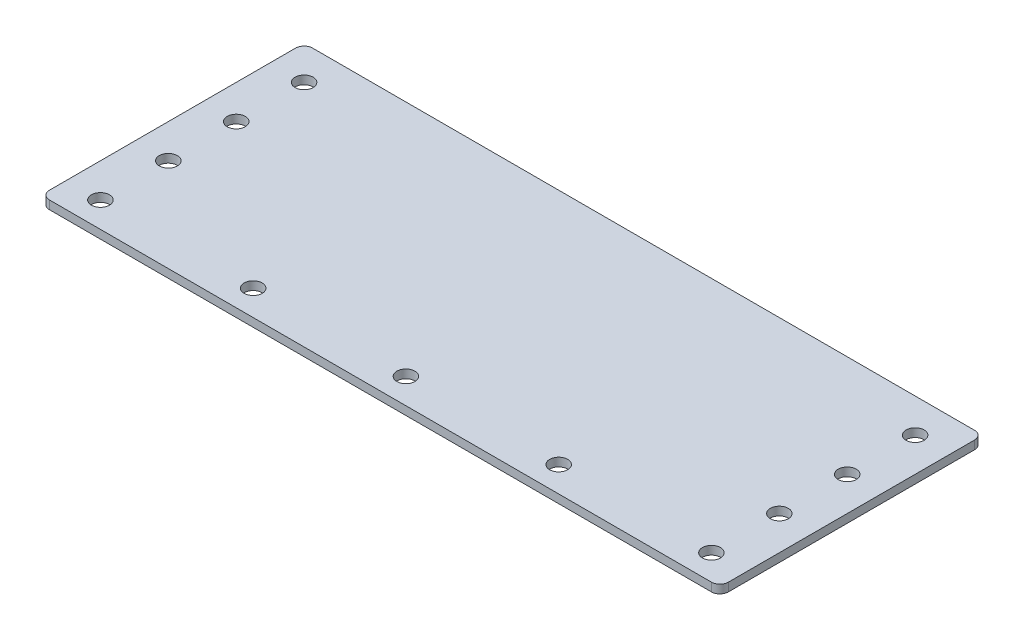
ISO-10303-21;
HEADER;
FILE_DESCRIPTION(('STEP AP214'),'2;1');
FILE_NAME('part.step','',(''),(''),'','','');
FILE_SCHEMA(('AUTOMOTIVE_DESIGN { 1 0 10303 214 1 1 1 1 }'));
ENDSEC;
DATA;
#1=APPLICATION_CONTEXT('core data for automotive mechanical design processes');
#2=APPLICATION_PROTOCOL_DEFINITION('international standard','automotive_design',2000,#1);
#3=PRODUCT_CONTEXT('',#1,'mechanical');
#4=PRODUCT('Part','Part','',(#3));
#5=PRODUCT_RELATED_PRODUCT_CATEGORY('part','',(#4));
#6=PRODUCT_DEFINITION_FORMATION('','',#4);
#7=PRODUCT_DEFINITION_CONTEXT('part definition',#1,'design');
#8=PRODUCT_DEFINITION('design','',#6,#7);
#9=PRODUCT_DEFINITION_SHAPE('','',#8);
#10=(LENGTH_UNIT() NAMED_UNIT(*) SI_UNIT(.MILLI.,.METRE.));
#11=(NAMED_UNIT(*) PLANE_ANGLE_UNIT() SI_UNIT($,.RADIAN.));
#12=(NAMED_UNIT(*) SI_UNIT($,.STERADIAN.) SOLID_ANGLE_UNIT());
#13=UNCERTAINTY_MEASURE_WITH_UNIT(LENGTH_MEASURE(1.E-05),#10,'distance_accuracy_value','');
#14=(GEOMETRIC_REPRESENTATION_CONTEXT(3) GLOBAL_UNCERTAINTY_ASSIGNED_CONTEXT((#13)) GLOBAL_UNIT_ASSIGNED_CONTEXT((#10,
#11,#12)) REPRESENTATION_CONTEXT('',''));
#15=CARTESIAN_POINT('',(0.,0.,0.));
#16=DIRECTION('',(0.,0.,1.));
#17=DIRECTION('',(1.,0.,0.));
#18=AXIS2_PLACEMENT_3D('',#15,#16,#17);
#19=CARTESIAN_POINT('',(0.,3.175,49.2125));
#20=DIRECTION('',(0.,0.,-1.));
#21=DIRECTION('',(-1.,0.,0.));
#22=AXIS2_PLACEMENT_3D('',#19,#20,#21);
#23=PLANE('',#22);
#24=DIRECTION('',(1.,0.,0.));
#25=VECTOR('',#24,1.);
#26=CARTESIAN_POINT('',(0.,3.175,49.2125));
#27=LINE('',#26,#25);
#28=CARTESIAN_POINT('',(-123.825,3.175,49.2125));
#29=VERTEX_POINT('',#28);
#30=CARTESIAN_POINT('',(123.825,3.175,49.2125));
#31=VERTEX_POINT('',#30);
#32=EDGE_CURVE('E156',#29,#31,#27,.T.);
#33=ORIENTED_EDGE('',*,*,#32,.F.);
#34=DIRECTION('',(0.,-1.,0.));
#35=VECTOR('',#34,1.);
#36=CARTESIAN_POINT('',(-123.825,0.,49.2125));
#37=LINE('',#36,#35);
#38=CARTESIAN_POINT('',(-123.825,0.,49.2125));
#39=VERTEX_POINT('',#38);
#40=EDGE_CURVE('E11',#29,#39,#37,.T.);
#41=ORIENTED_EDGE('',*,*,#40,.T.);
#42=DIRECTION('',(1.,0.,0.));
#43=VECTOR('',#42,1.);
#44=CARTESIAN_POINT('',(0.,0.,49.2125));
#45=LINE('',#44,#43);
#46=CARTESIAN_POINT('',(123.825,0.,49.2125));
#47=VERTEX_POINT('',#46);
#48=EDGE_CURVE('E159',#39,#47,#45,.T.);
#49=ORIENTED_EDGE('',*,*,#48,.T.);
#50=DIRECTION('',(0.,-1.,0.));
#51=VECTOR('',#50,1.);
#52=CARTESIAN_POINT('',(123.825,3.175,49.2125));
#53=LINE('',#52,#51);
#54=EDGE_CURVE('E45',#47,#31,#53,.F.);
#55=ORIENTED_EDGE('',*,*,#54,.T.);
#56=EDGE_LOOP('',(#33,#41,#49,#55));
#57=FACE_BOUND('',#56,.T.);
#58=ADVANCED_FACE('F37',(#57),#23,.F.);
#59=CARTESIAN_POINT('',(127.,3.175,0.));
#60=DIRECTION('',(-1.,0.,0.));
#61=DIRECTION('',(0.,0.,1.));
#62=AXIS2_PLACEMENT_3D('',#59,#60,#61);
#63=PLANE('',#62);
#64=DIRECTION('',(0.,0.,-1.));
#65=VECTOR('',#64,1.);
#66=CARTESIAN_POINT('',(127.,0.,0.));
#67=LINE('',#66,#65);
#68=CARTESIAN_POINT('',(127.,0.,46.0375));
#69=VERTEX_POINT('',#68);
#70=CARTESIAN_POINT('',(127.,0.,-46.0375));
#71=VERTEX_POINT('',#70);
#72=EDGE_CURVE('E123',#69,#71,#67,.T.);
#73=ORIENTED_EDGE('',*,*,#72,.T.);
#74=DIRECTION('',(0.,-1.,0.));
#75=VECTOR('',#74,1.);
#76=CARTESIAN_POINT('',(127.,3.175,-46.0375));
#77=LINE('',#76,#75);
#78=CARTESIAN_POINT('',(127.,3.175,-46.0375));
#79=VERTEX_POINT('',#78);
#80=EDGE_CURVE('E140',#71,#79,#77,.F.);
#81=ORIENTED_EDGE('',*,*,#80,.T.);
#82=DIRECTION('',(0.,0.,-1.));
#83=VECTOR('',#82,1.);
#84=CARTESIAN_POINT('',(127.,3.175,0.));
#85=LINE('',#84,#83);
#86=CARTESIAN_POINT('',(127.,3.175,46.0375));
#87=VERTEX_POINT('',#86);
#88=EDGE_CURVE('E166',#87,#79,#85,.T.);
#89=ORIENTED_EDGE('',*,*,#88,.F.);
#90=DIRECTION('',(0.,-1.,0.));
#91=VECTOR('',#90,1.);
#92=CARTESIAN_POINT('',(127.,3.175,46.0375));
#93=LINE('',#92,#91);
#94=EDGE_CURVE('E137',#87,#69,#93,.T.);
#95=ORIENTED_EDGE('',*,*,#94,.T.);
#96=EDGE_LOOP('',(#73,#81,#89,#95));
#97=FACE_BOUND('',#96,.T.);
#98=ADVANCED_FACE('F172',(#97),#63,.F.);
#99=CARTESIAN_POINT('',(0.,3.175,-49.2125));
#100=DIRECTION('',(0.,0.,-1.));
#101=DIRECTION('',(-1.,0.,0.));
#102=AXIS2_PLACEMENT_3D('',#99,#100,#101);
#103=PLANE('',#102);
#104=DIRECTION('',(1.,0.,0.));
#105=VECTOR('',#104,1.);
#106=CARTESIAN_POINT('',(0.,3.175,-49.2125));
#107=LINE('',#106,#105);
#108=CARTESIAN_POINT('',(-123.825,3.175,-49.2125));
#109=VERTEX_POINT('',#108);
#110=CARTESIAN_POINT('',(123.825,3.175,-49.2125));
#111=VERTEX_POINT('',#110);
#112=EDGE_CURVE('E130',#109,#111,#107,.T.);
#113=ORIENTED_EDGE('',*,*,#112,.T.);
#114=DIRECTION('',(0.,-1.,0.));
#115=VECTOR('',#114,1.);
#116=CARTESIAN_POINT('',(123.825,0.,-49.2125));
#117=LINE('',#116,#115);
#118=CARTESIAN_POINT('',(123.825,0.,-49.2125));
#119=VERTEX_POINT('',#118);
#120=EDGE_CURVE('E122',#111,#119,#117,.T.);
#121=ORIENTED_EDGE('',*,*,#120,.T.);
#122=DIRECTION('',(1.,0.,0.));
#123=VECTOR('',#122,1.);
#124=CARTESIAN_POINT('',(0.,0.,-49.2125));
#125=LINE('',#124,#123);
#126=CARTESIAN_POINT('',(-123.825,0.,-49.2125));
#127=VERTEX_POINT('',#126);
#128=EDGE_CURVE('E107',#127,#119,#125,.T.);
#129=ORIENTED_EDGE('',*,*,#128,.F.);
#130=DIRECTION('',(0.,-1.,0.));
#131=VECTOR('',#130,1.);
#132=CARTESIAN_POINT('',(-123.825,3.175,-49.2125));
#133=LINE('',#132,#131);
#134=EDGE_CURVE('E120',#127,#109,#133,.F.);
#135=ORIENTED_EDGE('',*,*,#134,.T.);
#136=EDGE_LOOP('',(#113,#121,#129,#135));
#137=FACE_BOUND('',#136,.T.);
#138=ADVANCED_FACE('F119',(#137),#103,.T.);
#139=CARTESIAN_POINT('',(-127.,3.175,0.));
#140=DIRECTION('',(-1.,0.,0.));
#141=DIRECTION('',(0.,0.,1.));
#142=AXIS2_PLACEMENT_3D('',#139,#140,#141);
#143=PLANE('',#142);
#144=DIRECTION('',(0.,0.,-1.));
#145=VECTOR('',#144,1.);
#146=CARTESIAN_POINT('',(-127.,3.175,0.));
#147=LINE('',#146,#145);
#148=CARTESIAN_POINT('',(-127.,3.175,46.0375));
#149=VERTEX_POINT('',#148);
#150=CARTESIAN_POINT('',(-127.,3.175,-46.0375));
#151=VERTEX_POINT('',#150);
#152=EDGE_CURVE('E126',#149,#151,#147,.T.);
#153=ORIENTED_EDGE('',*,*,#152,.T.);
#154=DIRECTION('',(0.,-1.,0.));
#155=VECTOR('',#154,1.);
#156=CARTESIAN_POINT('',(-127.,3.175,-46.0375));
#157=LINE('',#156,#155);
#158=CARTESIAN_POINT('',(-127.,0.,-46.0375));
#159=VERTEX_POINT('',#158);
#160=EDGE_CURVE('E150',#151,#159,#157,.T.);
#161=ORIENTED_EDGE('',*,*,#160,.T.);
#162=DIRECTION('',(0.,0.,-1.));
#163=VECTOR('',#162,1.);
#164=CARTESIAN_POINT('',(-127.,0.,0.));
#165=LINE('',#164,#163);
#166=CARTESIAN_POINT('',(-127.,0.,46.0375));
#167=VERTEX_POINT('',#166);
#168=EDGE_CURVE('E108',#167,#159,#165,.T.);
#169=ORIENTED_EDGE('',*,*,#168,.F.);
#170=DIRECTION('',(0.,-1.,0.));
#171=VECTOR('',#170,1.);
#172=CARTESIAN_POINT('',(-127.,3.175,46.0375));
#173=LINE('',#172,#171);
#174=EDGE_CURVE('E59',#167,#149,#173,.F.);
#175=ORIENTED_EDGE('',*,*,#174,.T.);
#176=EDGE_LOOP('',(#153,#161,#169,#175));
#177=FACE_BOUND('',#176,.T.);
#178=ADVANCED_FACE('F303',(#177),#143,.T.);
#179=CARTESIAN_POINT('',(0.,3.175,0.));
#180=DIRECTION('',(0.,1.,0.));
#181=DIRECTION('',(0.,0.,1.));
#182=AXIS2_PLACEMENT_3D('',#179,#180,#181);
#183=PLANE('',#182);
#184=CARTESIAN_POINT('',(114.3,3.175,-36.5125));
#185=DIRECTION('',(0.,-1.,0.));
#186=DIRECTION('',(0.,0.,-1.));
#187=AXIS2_PLACEMENT_3D('',#184,#185,#186);
#188=CIRCLE('',#187,3.3782);
#189=CARTESIAN_POINT('',(114.3,3.175,-39.8907));
#190=VERTEX_POINT('',#189);
#191=EDGE_CURVE('E239',#190,#190,#188,.T.);
#192=ORIENTED_EDGE('',*,*,#191,.T.);
#193=EDGE_LOOP('',(#192));
#194=FACE_BOUND('',#193,.T.);
#195=CARTESIAN_POINT('',(114.3,3.175,-11.1125));
#196=DIRECTION('',(0.,-1.,0.));
#197=DIRECTION('',(0.,0.,-1.));
#198=AXIS2_PLACEMENT_3D('',#195,#196,#197);
#199=CIRCLE('',#198,3.3782);
#200=CARTESIAN_POINT('',(114.3,3.175,-14.4907));
#201=VERTEX_POINT('',#200);
#202=EDGE_CURVE('E233',#201,#201,#199,.T.);
#203=ORIENTED_EDGE('',*,*,#202,.T.);
#204=EDGE_LOOP('',(#203));
#205=FACE_BOUND('',#204,.T.);
#206=CARTESIAN_POINT('',(114.299999999999,3.175,14.2875));
#207=DIRECTION('',(0.,-1.,0.));
#208=DIRECTION('',(0.,0.,-1.));
#209=AXIS2_PLACEMENT_3D('',#206,#207,#208);
#210=CIRCLE('',#209,3.3782);
#211=CARTESIAN_POINT('',(114.299999999999,3.175,10.9093));
#212=VERTEX_POINT('',#211);
#213=EDGE_CURVE('E227',#212,#212,#210,.T.);
#214=ORIENTED_EDGE('',*,*,#213,.T.);
#215=EDGE_LOOP('',(#214));
#216=FACE_BOUND('',#215,.T.);
#217=CARTESIAN_POINT('',(57.1499999999992,3.175,39.6875));
#218=DIRECTION('',(0.,-1.,0.));
#219=DIRECTION('',(0.,0.,-1.));
#220=AXIS2_PLACEMENT_3D('',#217,#218,#219);
#221=CIRCLE('',#220,3.3782);
#222=CARTESIAN_POINT('',(57.1499999999992,3.175,36.3093));
#223=VERTEX_POINT('',#222);
#224=EDGE_CURVE('E221',#223,#223,#221,.T.);
#225=ORIENTED_EDGE('',*,*,#224,.T.);
#226=EDGE_LOOP('',(#225));
#227=FACE_BOUND('',#226,.T.);
#228=CARTESIAN_POINT('',(7.7715611723761E-13,3.175,39.6875));
#229=DIRECTION('',(0.,-1.,0.));
#230=DIRECTION('',(0.,0.,-1.));
#231=AXIS2_PLACEMENT_3D('',#228,#229,#230);
#232=CIRCLE('',#231,3.3782);
#233=CARTESIAN_POINT('',(7.7715611723761E-13,3.175,36.3093));
#234=VERTEX_POINT('',#233);
#235=EDGE_CURVE('E215',#234,#234,#232,.T.);
#236=ORIENTED_EDGE('',*,*,#235,.T.);
#237=EDGE_LOOP('',(#236));
#238=FACE_BOUND('',#237,.T.);
#239=CARTESIAN_POINT('',(-57.1499999999992,3.175,39.6875));
#240=DIRECTION('',(0.,-1.,0.));
#241=DIRECTION('',(0.,0.,-1.));
#242=AXIS2_PLACEMENT_3D('',#239,#240,#241);
#243=CIRCLE('',#242,3.3782);
#244=CARTESIAN_POINT('',(-57.1499999999992,3.175,36.3093));
#245=VERTEX_POINT('',#244);
#246=EDGE_CURVE('E209',#245,#245,#243,.T.);
#247=ORIENTED_EDGE('',*,*,#246,.T.);
#248=EDGE_LOOP('',(#247));
#249=FACE_BOUND('',#248,.T.);
#250=CARTESIAN_POINT('',(-114.299999999999,3.175,14.2875));
#251=DIRECTION('',(0.,-1.,0.));
#252=DIRECTION('',(0.,0.,-1.));
#253=AXIS2_PLACEMENT_3D('',#250,#251,#252);
#254=CIRCLE('',#253,3.3782);
#255=CARTESIAN_POINT('',(-114.299999999999,3.175,10.9093));
#256=VERTEX_POINT('',#255);
#257=EDGE_CURVE('E203',#256,#256,#254,.T.);
#258=ORIENTED_EDGE('',*,*,#257,.T.);
#259=EDGE_LOOP('',(#258));
#260=FACE_BOUND('',#259,.T.);
#261=CARTESIAN_POINT('',(-114.3,3.175,-11.1125));
#262=DIRECTION('',(0.,-1.,0.));
#263=DIRECTION('',(0.,0.,-1.));
#264=AXIS2_PLACEMENT_3D('',#261,#262,#263);
#265=CIRCLE('',#264,3.3782);
#266=CARTESIAN_POINT('',(-114.3,3.175,-14.4907));
#267=VERTEX_POINT('',#266);
#268=EDGE_CURVE('E197',#267,#267,#265,.T.);
#269=ORIENTED_EDGE('',*,*,#268,.T.);
#270=EDGE_LOOP('',(#269));
#271=FACE_BOUND('',#270,.T.);
#272=CARTESIAN_POINT('',(-114.3,3.175,-36.5125));
#273=DIRECTION('',(0.,-1.,0.));
#274=DIRECTION('',(0.,0.,-1.));
#275=AXIS2_PLACEMENT_3D('',#272,#273,#274);
#276=CIRCLE('',#275,3.3782);
#277=CARTESIAN_POINT('',(-114.3,3.175,-39.8907));
#278=VERTEX_POINT('',#277);
#279=EDGE_CURVE('E191',#278,#278,#276,.T.);
#280=ORIENTED_EDGE('',*,*,#279,.T.);
#281=EDGE_LOOP('',(#280));
#282=FACE_BOUND('',#281,.T.);
#283=CARTESIAN_POINT('',(-114.299999999999,3.175,39.6875));
#284=DIRECTION('',(0.,-1.,0.));
#285=DIRECTION('',(0.,0.,-1.));
#286=AXIS2_PLACEMENT_3D('',#283,#284,#285);
#287=CIRCLE('',#286,3.3782);
#288=CARTESIAN_POINT('',(-114.299999999999,3.175,36.3093));
#289=VERTEX_POINT('',#288);
#290=EDGE_CURVE('E185',#289,#289,#287,.T.);
#291=ORIENTED_EDGE('',*,*,#290,.T.);
#292=EDGE_LOOP('',(#291));
#293=FACE_BOUND('',#292,.T.);
#294=CARTESIAN_POINT('',(114.299999999999,3.175,39.6875));
#295=DIRECTION('',(0.,-1.,0.));
#296=DIRECTION('',(0.,0.,-1.));
#297=AXIS2_PLACEMENT_3D('',#294,#295,#296);
#298=CIRCLE('',#297,3.3782);
#299=CARTESIAN_POINT('',(114.299999999999,3.175,36.3093));
#300=VERTEX_POINT('',#299);
#301=EDGE_CURVE('E175',#300,#300,#298,.T.);
#302=ORIENTED_EDGE('',*,*,#301,.T.);
#303=EDGE_LOOP('',(#302));
#304=FACE_BOUND('',#303,.T.);
#305=ORIENTED_EDGE('',*,*,#88,.T.);
#306=CARTESIAN_POINT('',(123.825,3.175,-46.0375));
#307=DIRECTION('',(0.,1.,0.));
#308=DIRECTION('',(0.,0.,1.));
#309=AXIS2_PLACEMENT_3D('',#306,#307,#308);
#310=CIRCLE('',#309,3.175);
#311=EDGE_CURVE('E147',#79,#111,#310,.T.);
#312=ORIENTED_EDGE('',*,*,#311,.T.);
#313=ORIENTED_EDGE('',*,*,#112,.F.);
#314=CARTESIAN_POINT('',(-123.825,3.175,-46.0375));
#315=DIRECTION('',(0.,1.,0.));
#316=DIRECTION('',(0.,0.,1.));
#317=AXIS2_PLACEMENT_3D('',#314,#315,#316);
#318=CIRCLE('',#317,3.175);
#319=EDGE_CURVE('E52',#109,#151,#318,.T.);
#320=ORIENTED_EDGE('',*,*,#319,.T.);
#321=ORIENTED_EDGE('',*,*,#152,.F.);
#322=CARTESIAN_POINT('',(-123.825,3.175,46.0375));
#323=DIRECTION('',(0.,1.,0.));
#324=DIRECTION('',(0.,0.,1.));
#325=AXIS2_PLACEMENT_3D('',#322,#323,#324);
#326=CIRCLE('',#325,3.175);
#327=EDGE_CURVE('E144',#149,#29,#326,.T.);
#328=ORIENTED_EDGE('',*,*,#327,.T.);
#329=ORIENTED_EDGE('',*,*,#32,.T.);
#330=CARTESIAN_POINT('',(123.825,3.175,46.0375));
#331=DIRECTION('',(0.,1.,0.));
#332=DIRECTION('',(0.,0.,1.));
#333=AXIS2_PLACEMENT_3D('',#330,#331,#332);
#334=CIRCLE('',#333,3.175);
#335=EDGE_CURVE('E142',#31,#87,#334,.T.);
#336=ORIENTED_EDGE('',*,*,#335,.T.);
#337=EDGE_LOOP('',(#305,#312,#313,#320,#321,#328,#329,#336));
#338=FACE_BOUND('',#337,.T.);
#339=ADVANCED_FACE('F163',(#194,#205,#216,#227,#238,#249,#260,#271,#282,#293,#304,#338),#183,.T.);
#340=CARTESIAN_POINT('',(0.,0.,0.));
#341=DIRECTION('',(0.,1.,0.));
#342=DIRECTION('',(0.,0.,1.));
#343=AXIS2_PLACEMENT_3D('',#340,#341,#342);
#344=PLANE('',#343);
#345=CARTESIAN_POINT('',(114.3,0.,-36.5125));
#346=DIRECTION('',(0.,-1.,0.));
#347=DIRECTION('',(0.,0.,-1.));
#348=AXIS2_PLACEMENT_3D('',#345,#346,#347);
#349=CIRCLE('',#348,3.37819999999998);
#350=CARTESIAN_POINT('',(114.3,0.,-39.8907));
#351=VERTEX_POINT('',#350);
#352=EDGE_CURVE('E242',#351,#351,#349,.T.);
#353=ORIENTED_EDGE('',*,*,#352,.F.);
#354=EDGE_LOOP('',(#353));
#355=FACE_BOUND('',#354,.T.);
#356=CARTESIAN_POINT('',(114.3,0.,-11.1125));
#357=DIRECTION('',(0.,-1.,0.));
#358=DIRECTION('',(0.,0.,-1.));
#359=AXIS2_PLACEMENT_3D('',#356,#357,#358);
#360=CIRCLE('',#359,3.37819999999998);
#361=CARTESIAN_POINT('',(114.3,0.,-14.4907));
#362=VERTEX_POINT('',#361);
#363=EDGE_CURVE('E236',#362,#362,#360,.T.);
#364=ORIENTED_EDGE('',*,*,#363,.F.);
#365=EDGE_LOOP('',(#364));
#366=FACE_BOUND('',#365,.T.);
#367=CARTESIAN_POINT('',(114.299999999999,0.,14.2875));
#368=DIRECTION('',(0.,-1.,0.));
#369=DIRECTION('',(0.,0.,-1.));
#370=AXIS2_PLACEMENT_3D('',#367,#368,#369);
#371=CIRCLE('',#370,3.37819999999998);
#372=CARTESIAN_POINT('',(114.299999999999,0.,10.9093));
#373=VERTEX_POINT('',#372);
#374=EDGE_CURVE('E230',#373,#373,#371,.T.);
#375=ORIENTED_EDGE('',*,*,#374,.F.);
#376=EDGE_LOOP('',(#375));
#377=FACE_BOUND('',#376,.T.);
#378=CARTESIAN_POINT('',(57.1499999999992,0.,39.6875));
#379=DIRECTION('',(0.,-1.,0.));
#380=DIRECTION('',(0.,0.,-1.));
#381=AXIS2_PLACEMENT_3D('',#378,#379,#380);
#382=CIRCLE('',#381,3.37819999999998);
#383=CARTESIAN_POINT('',(57.1499999999992,0.,36.3093));
#384=VERTEX_POINT('',#383);
#385=EDGE_CURVE('E224',#384,#384,#382,.T.);
#386=ORIENTED_EDGE('',*,*,#385,.F.);
#387=EDGE_LOOP('',(#386));
#388=FACE_BOUND('',#387,.T.);
#389=CARTESIAN_POINT('',(7.7715611723761E-13,0.,39.6875));
#390=DIRECTION('',(0.,-1.,0.));
#391=DIRECTION('',(0.,0.,-1.));
#392=AXIS2_PLACEMENT_3D('',#389,#390,#391);
#393=CIRCLE('',#392,3.37819999999999);
#394=CARTESIAN_POINT('',(7.7715611723761E-13,0.,36.3093));
#395=VERTEX_POINT('',#394);
#396=EDGE_CURVE('E218',#395,#395,#393,.T.);
#397=ORIENTED_EDGE('',*,*,#396,.F.);
#398=EDGE_LOOP('',(#397));
#399=FACE_BOUND('',#398,.T.);
#400=CARTESIAN_POINT('',(-57.1499999999992,0.,39.6875));
#401=DIRECTION('',(0.,-1.,0.));
#402=DIRECTION('',(0.,0.,-1.));
#403=AXIS2_PLACEMENT_3D('',#400,#401,#402);
#404=CIRCLE('',#403,3.37819999999999);
#405=CARTESIAN_POINT('',(-57.1499999999992,0.,36.3093));
#406=VERTEX_POINT('',#405);
#407=EDGE_CURVE('E212',#406,#406,#404,.T.);
#408=ORIENTED_EDGE('',*,*,#407,.F.);
#409=EDGE_LOOP('',(#408));
#410=FACE_BOUND('',#409,.T.);
#411=CARTESIAN_POINT('',(-114.299999999999,0.,14.2875));
#412=DIRECTION('',(0.,-1.,0.));
#413=DIRECTION('',(0.,0.,-1.));
#414=AXIS2_PLACEMENT_3D('',#411,#412,#413);
#415=CIRCLE('',#414,3.37819999999998);
#416=CARTESIAN_POINT('',(-114.299999999999,0.,10.9093));
#417=VERTEX_POINT('',#416);
#418=EDGE_CURVE('E206',#417,#417,#415,.T.);
#419=ORIENTED_EDGE('',*,*,#418,.F.);
#420=EDGE_LOOP('',(#419));
#421=FACE_BOUND('',#420,.T.);
#422=CARTESIAN_POINT('',(-114.3,0.,-11.1125));
#423=DIRECTION('',(0.,-1.,0.));
#424=DIRECTION('',(0.,0.,-1.));
#425=AXIS2_PLACEMENT_3D('',#422,#423,#424);
#426=CIRCLE('',#425,3.37819999999998);
#427=CARTESIAN_POINT('',(-114.3,0.,-14.4907));
#428=VERTEX_POINT('',#427);
#429=EDGE_CURVE('E200',#428,#428,#426,.T.);
#430=ORIENTED_EDGE('',*,*,#429,.F.);
#431=EDGE_LOOP('',(#430));
#432=FACE_BOUND('',#431,.T.);
#433=CARTESIAN_POINT('',(-114.3,0.,-36.5125));
#434=DIRECTION('',(0.,-1.,0.));
#435=DIRECTION('',(0.,0.,-1.));
#436=AXIS2_PLACEMENT_3D('',#433,#434,#435);
#437=CIRCLE('',#436,3.37819999999998);
#438=CARTESIAN_POINT('',(-114.3,0.,-39.8907));
#439=VERTEX_POINT('',#438);
#440=EDGE_CURVE('E194',#439,#439,#437,.T.);
#441=ORIENTED_EDGE('',*,*,#440,.F.);
#442=EDGE_LOOP('',(#441));
#443=FACE_BOUND('',#442,.T.);
#444=CARTESIAN_POINT('',(-114.299999999999,0.,39.6875));
#445=DIRECTION('',(0.,-1.,0.));
#446=DIRECTION('',(0.,0.,-1.));
#447=AXIS2_PLACEMENT_3D('',#444,#445,#446);
#448=CIRCLE('',#447,3.37819999999998);
#449=CARTESIAN_POINT('',(-114.299999999999,0.,36.3093));
#450=VERTEX_POINT('',#449);
#451=EDGE_CURVE('E188',#450,#450,#448,.T.);
#452=ORIENTED_EDGE('',*,*,#451,.F.);
#453=EDGE_LOOP('',(#452));
#454=FACE_BOUND('',#453,.T.);
#455=CARTESIAN_POINT('',(114.299999999999,0.,39.6875));
#456=DIRECTION('',(0.,-1.,0.));
#457=DIRECTION('',(0.,0.,-1.));
#458=AXIS2_PLACEMENT_3D('',#455,#456,#457);
#459=CIRCLE('',#458,3.37819999999998);
#460=CARTESIAN_POINT('',(114.299999999999,0.,36.3093));
#461=VERTEX_POINT('',#460);
#462=EDGE_CURVE('E182',#461,#461,#459,.T.);
#463=ORIENTED_EDGE('',*,*,#462,.F.);
#464=EDGE_LOOP('',(#463));
#465=FACE_BOUND('',#464,.T.);
#466=ORIENTED_EDGE('',*,*,#128,.T.);
#467=CARTESIAN_POINT('',(123.825,0.,-46.0375));
#468=DIRECTION('',(0.,1.,0.));
#469=DIRECTION('',(0.,0.,1.));
#470=AXIS2_PLACEMENT_3D('',#467,#468,#469);
#471=CIRCLE('',#470,3.175);
#472=EDGE_CURVE('E113',#119,#71,#471,.F.);
#473=ORIENTED_EDGE('',*,*,#472,.T.);
#474=ORIENTED_EDGE('',*,*,#72,.F.);
#475=CARTESIAN_POINT('',(123.825,0.,46.0375));
#476=DIRECTION('',(0.,1.,0.));
#477=DIRECTION('',(0.,0.,1.));
#478=AXIS2_PLACEMENT_3D('',#475,#476,#477);
#479=CIRCLE('',#478,3.175);
#480=EDGE_CURVE('E128',#69,#47,#479,.F.);
#481=ORIENTED_EDGE('',*,*,#480,.T.);
#482=ORIENTED_EDGE('',*,*,#48,.F.);
#483=CARTESIAN_POINT('',(-123.825,0.,46.0375));
#484=DIRECTION('',(0.,1.,0.));
#485=DIRECTION('',(0.,0.,1.));
#486=AXIS2_PLACEMENT_3D('',#483,#484,#485);
#487=CIRCLE('',#486,3.175);
#488=EDGE_CURVE('E114',#39,#167,#487,.F.);
#489=ORIENTED_EDGE('',*,*,#488,.T.);
#490=ORIENTED_EDGE('',*,*,#168,.T.);
#491=CARTESIAN_POINT('',(-123.825,0.,-46.0375));
#492=DIRECTION('',(0.,1.,0.));
#493=DIRECTION('',(0.,0.,1.));
#494=AXIS2_PLACEMENT_3D('',#491,#492,#493);
#495=CIRCLE('',#494,3.175);
#496=EDGE_CURVE('E104',#159,#127,#495,.F.);
#497=ORIENTED_EDGE('',*,*,#496,.T.);
#498=EDGE_LOOP('',(#466,#473,#474,#481,#482,#489,#490,#497));
#499=FACE_BOUND('',#498,.T.);
#500=ADVANCED_FACE('F106',(#355,#366,#377,#388,#399,#410,#421,#432,#443,#454,#465,#499),#344,.F.);
#501=CARTESIAN_POINT('',(114.299999999999,0.,39.6875));
#502=DIRECTION('',(0.,-1.,0.));
#503=DIRECTION('',(0.,0.,-1.));
#504=AXIS2_PLACEMENT_3D('',#501,#502,#503);
#505=CYLINDRICAL_SURFACE('',#504,3.37819999999999);
#506=ORIENTED_EDGE('',*,*,#301,.F.);
#507=EDGE_LOOP('',(#506));
#508=FACE_BOUND('',#507,.T.);
#509=ORIENTED_EDGE('',*,*,#462,.T.);
#510=EDGE_LOOP('',(#509));
#511=FACE_BOUND('',#510,.T.);
#512=ADVANCED_FACE('F250',(#508,#511),#505,.F.);
#513=CARTESIAN_POINT('',(-114.299999999999,0.,39.6875));
#514=DIRECTION('',(0.,-1.,0.));
#515=DIRECTION('',(0.,0.,-1.));
#516=AXIS2_PLACEMENT_3D('',#513,#514,#515);
#517=CYLINDRICAL_SURFACE('',#516,3.37819999999999);
#518=ORIENTED_EDGE('',*,*,#290,.F.);
#519=EDGE_LOOP('',(#518));
#520=FACE_BOUND('',#519,.T.);
#521=ORIENTED_EDGE('',*,*,#451,.T.);
#522=EDGE_LOOP('',(#521));
#523=FACE_BOUND('',#522,.T.);
#524=ADVANCED_FACE('F273',(#520,#523),#517,.F.);
#525=CARTESIAN_POINT('',(-114.3,0.,-36.5125));
#526=DIRECTION('',(0.,-1.,0.));
#527=DIRECTION('',(0.,0.,-1.));
#528=AXIS2_PLACEMENT_3D('',#525,#526,#527);
#529=CYLINDRICAL_SURFACE('',#528,3.37819999999999);
#530=ORIENTED_EDGE('',*,*,#279,.F.);
#531=EDGE_LOOP('',(#530));
#532=FACE_BOUND('',#531,.T.);
#533=ORIENTED_EDGE('',*,*,#440,.T.);
#534=EDGE_LOOP('',(#533));
#535=FACE_BOUND('',#534,.T.);
#536=ADVANCED_FACE('F279',(#532,#535),#529,.F.);
#537=CARTESIAN_POINT('',(-114.3,0.,-11.1125));
#538=DIRECTION('',(0.,-1.,0.));
#539=DIRECTION('',(0.,0.,-1.));
#540=AXIS2_PLACEMENT_3D('',#537,#538,#539);
#541=CYLINDRICAL_SURFACE('',#540,3.37819999999999);
#542=ORIENTED_EDGE('',*,*,#268,.F.);
#543=EDGE_LOOP('',(#542));
#544=FACE_BOUND('',#543,.T.);
#545=ORIENTED_EDGE('',*,*,#429,.T.);
#546=EDGE_LOOP('',(#545));
#547=FACE_BOUND('',#546,.T.);
#548=ADVANCED_FACE('F391',(#544,#547),#541,.F.);
#549=CARTESIAN_POINT('',(-114.299999999999,0.,14.2875));
#550=DIRECTION('',(0.,-1.,0.));
#551=DIRECTION('',(0.,0.,-1.));
#552=AXIS2_PLACEMENT_3D('',#549,#550,#551);
#553=CYLINDRICAL_SURFACE('',#552,3.37819999999999);
#554=ORIENTED_EDGE('',*,*,#257,.F.);
#555=EDGE_LOOP('',(#554));
#556=FACE_BOUND('',#555,.T.);
#557=ORIENTED_EDGE('',*,*,#418,.T.);
#558=EDGE_LOOP('',(#557));
#559=FACE_BOUND('',#558,.T.);
#560=ADVANCED_FACE('F381',(#556,#559),#553,.F.);
#561=CARTESIAN_POINT('',(-57.1499999999992,0.,39.6875));
#562=DIRECTION('',(0.,-1.,0.));
#563=DIRECTION('',(0.,0.,-1.));
#564=AXIS2_PLACEMENT_3D('',#561,#562,#563);
#565=CYLINDRICAL_SURFACE('',#564,3.37819999999999);
#566=ORIENTED_EDGE('',*,*,#246,.F.);
#567=EDGE_LOOP('',(#566));
#568=FACE_BOUND('',#567,.T.);
#569=ORIENTED_EDGE('',*,*,#407,.T.);
#570=EDGE_LOOP('',(#569));
#571=FACE_BOUND('',#570,.T.);
#572=ADVANCED_FACE('F371',(#568,#571),#565,.F.);
#573=CARTESIAN_POINT('',(7.7715611723761E-13,0.,39.6875));
#574=DIRECTION('',(0.,-1.,0.));
#575=DIRECTION('',(0.,0.,-1.));
#576=AXIS2_PLACEMENT_3D('',#573,#574,#575);
#577=CYLINDRICAL_SURFACE('',#576,3.37819999999999);
#578=ORIENTED_EDGE('',*,*,#235,.F.);
#579=EDGE_LOOP('',(#578));
#580=FACE_BOUND('',#579,.T.);
#581=ORIENTED_EDGE('',*,*,#396,.T.);
#582=EDGE_LOOP('',(#581));
#583=FACE_BOUND('',#582,.T.);
#584=ADVANCED_FACE('F361',(#580,#583),#577,.F.);
#585=CARTESIAN_POINT('',(57.1499999999992,0.,39.6875));
#586=DIRECTION('',(0.,-1.,0.));
#587=DIRECTION('',(0.,0.,-1.));
#588=AXIS2_PLACEMENT_3D('',#585,#586,#587);
#589=CYLINDRICAL_SURFACE('',#588,3.37819999999999);
#590=ORIENTED_EDGE('',*,*,#224,.F.);
#591=EDGE_LOOP('',(#590));
#592=FACE_BOUND('',#591,.T.);
#593=ORIENTED_EDGE('',*,*,#385,.T.);
#594=EDGE_LOOP('',(#593));
#595=FACE_BOUND('',#594,.T.);
#596=ADVANCED_FACE('F351',(#592,#595),#589,.F.);
#597=CARTESIAN_POINT('',(114.299999999999,0.,14.2875));
#598=DIRECTION('',(0.,-1.,0.));
#599=DIRECTION('',(0.,0.,-1.));
#600=AXIS2_PLACEMENT_3D('',#597,#598,#599);
#601=CYLINDRICAL_SURFACE('',#600,3.37819999999999);
#602=ORIENTED_EDGE('',*,*,#213,.F.);
#603=EDGE_LOOP('',(#602));
#604=FACE_BOUND('',#603,.T.);
#605=ORIENTED_EDGE('',*,*,#374,.T.);
#606=EDGE_LOOP('',(#605));
#607=FACE_BOUND('',#606,.T.);
#608=ADVANCED_FACE('F341',(#604,#607),#601,.F.);
#609=CARTESIAN_POINT('',(114.3,0.,-11.1125));
#610=DIRECTION('',(0.,-1.,0.));
#611=DIRECTION('',(0.,0.,-1.));
#612=AXIS2_PLACEMENT_3D('',#609,#610,#611);
#613=CYLINDRICAL_SURFACE('',#612,3.37819999999999);
#614=ORIENTED_EDGE('',*,*,#202,.F.);
#615=EDGE_LOOP('',(#614));
#616=FACE_BOUND('',#615,.T.);
#617=ORIENTED_EDGE('',*,*,#363,.T.);
#618=EDGE_LOOP('',(#617));
#619=FACE_BOUND('',#618,.T.);
#620=ADVANCED_FACE('F330',(#616,#619),#613,.F.);
#621=CARTESIAN_POINT('',(114.3,0.,-36.5125));
#622=DIRECTION('',(0.,-1.,0.));
#623=DIRECTION('',(0.,0.,-1.));
#624=AXIS2_PLACEMENT_3D('',#621,#622,#623);
#625=CYLINDRICAL_SURFACE('',#624,3.37819999999999);
#626=ORIENTED_EDGE('',*,*,#191,.F.);
#627=EDGE_LOOP('',(#626));
#628=FACE_BOUND('',#627,.T.);
#629=ORIENTED_EDGE('',*,*,#352,.T.);
#630=EDGE_LOOP('',(#629));
#631=FACE_BOUND('',#630,.T.);
#632=ADVANCED_FACE('F246',(#628,#631),#625,.F.);
#633=CARTESIAN_POINT('',(123.825,3.175,-46.0375));
#634=DIRECTION('',(0.,1.,0.));
#635=DIRECTION('',(0.,0.,1.));
#636=AXIS2_PLACEMENT_3D('',#633,#634,#635);
#637=CYLINDRICAL_SURFACE('',#636,3.175);
#638=ORIENTED_EDGE('',*,*,#311,.F.);
#639=ORIENTED_EDGE('',*,*,#80,.F.);
#640=ORIENTED_EDGE('',*,*,#472,.F.);
#641=ORIENTED_EDGE('',*,*,#120,.F.);
#642=EDGE_LOOP('',(#638,#639,#640,#641));
#643=FACE_BOUND('',#642,.T.);
#644=ADVANCED_FACE('F292',(#643),#637,.T.);
#645=CARTESIAN_POINT('',(-123.825,3.175,-46.0375));
#646=DIRECTION('',(0.,-1.,0.));
#647=DIRECTION('',(0.,0.,-1.));
#648=AXIS2_PLACEMENT_3D('',#645,#646,#647);
#649=CYLINDRICAL_SURFACE('',#648,3.175);
#650=ORIENTED_EDGE('',*,*,#319,.F.);
#651=ORIENTED_EDGE('',*,*,#134,.F.);
#652=ORIENTED_EDGE('',*,*,#496,.F.);
#653=ORIENTED_EDGE('',*,*,#160,.F.);
#654=EDGE_LOOP('',(#650,#651,#652,#653));
#655=FACE_BOUND('',#654,.T.);
#656=ADVANCED_FACE('F125',(#655),#649,.T.);
#657=CARTESIAN_POINT('',(-123.825,3.175,46.0375));
#658=DIRECTION('',(0.,1.,0.));
#659=DIRECTION('',(0.,0.,1.));
#660=AXIS2_PLACEMENT_3D('',#657,#658,#659);
#661=CYLINDRICAL_SURFACE('',#660,3.175);
#662=ORIENTED_EDGE('',*,*,#327,.F.);
#663=ORIENTED_EDGE('',*,*,#174,.F.);
#664=ORIENTED_EDGE('',*,*,#488,.F.);
#665=ORIENTED_EDGE('',*,*,#40,.F.);
#666=EDGE_LOOP('',(#662,#663,#664,#665));
#667=FACE_BOUND('',#666,.T.);
#668=ADVANCED_FACE('F297',(#667),#661,.T.);
#669=CARTESIAN_POINT('',(123.825,3.175,46.0375));
#670=DIRECTION('',(0.,-1.,0.));
#671=DIRECTION('',(0.,0.,-1.));
#672=AXIS2_PLACEMENT_3D('',#669,#670,#671);
#673=CYLINDRICAL_SURFACE('',#672,3.175);
#674=ORIENTED_EDGE('',*,*,#335,.F.);
#675=ORIENTED_EDGE('',*,*,#54,.F.);
#676=ORIENTED_EDGE('',*,*,#480,.F.);
#677=ORIENTED_EDGE('',*,*,#94,.F.);
#678=EDGE_LOOP('',(#674,#675,#676,#677));
#679=FACE_BOUND('',#678,.T.);
#680=ADVANCED_FACE('F39',(#679),#673,.T.);
#681=CLOSED_SHELL('',(#58,#98,#138,#178,#339,#500,#512,#524,#536,#548,#560,#572,#584,#596,#608,
#620,#632,#644,#656,#668,#680));
#682=MANIFOLD_SOLID_BREP('B2',#681);
#683=ADVANCED_BREP_SHAPE_REPRESENTATION('',(#18,#682),#14);
#684=SHAPE_DEFINITION_REPRESENTATION(#9,#683);
ENDSEC;
END-ISO-10303-21;
